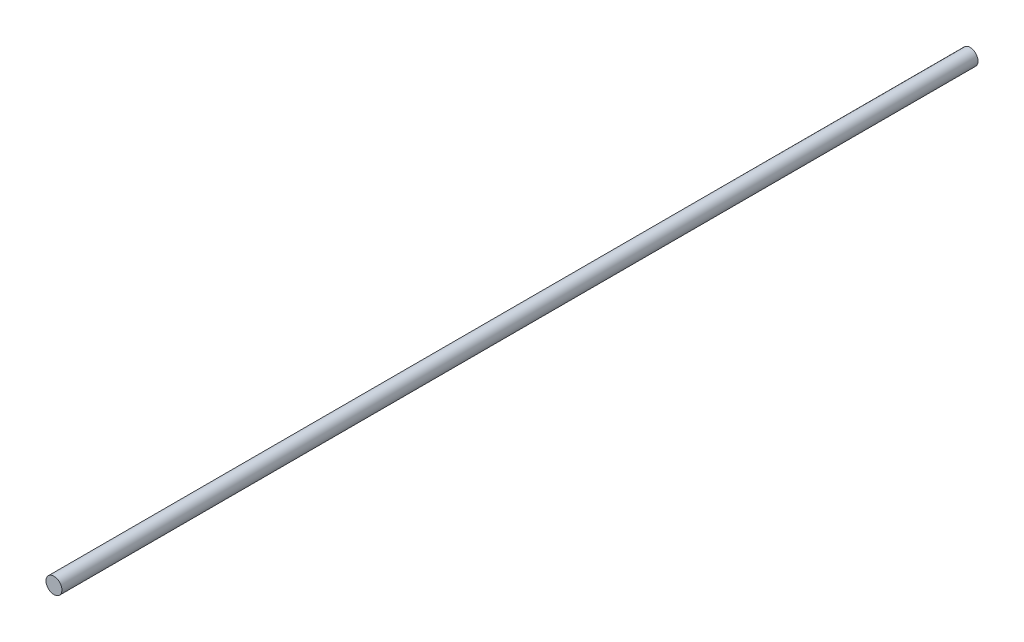
ISO-10303-21;
HEADER;
FILE_DESCRIPTION(('STEP AP214'),'2;1');
FILE_NAME('part.step','',(''),(''),'','','');
FILE_SCHEMA(('AUTOMOTIVE_DESIGN { 1 0 10303 214 1 1 1 1 }'));
ENDSEC;
DATA;
#1=APPLICATION_CONTEXT('core data for automotive mechanical design processes');
#2=APPLICATION_PROTOCOL_DEFINITION('international standard','automotive_design',2000,#1);
#3=PRODUCT_CONTEXT('',#1,'mechanical');
#4=PRODUCT('Part','Part','',(#3));
#5=PRODUCT_RELATED_PRODUCT_CATEGORY('part','',(#4));
#6=PRODUCT_DEFINITION_FORMATION('','',#4);
#7=PRODUCT_DEFINITION_CONTEXT('part definition',#1,'design');
#8=PRODUCT_DEFINITION('design','',#6,#7);
#9=PRODUCT_DEFINITION_SHAPE('','',#8);
#10=(LENGTH_UNIT() NAMED_UNIT(*) SI_UNIT(.MILLI.,.METRE.));
#11=(NAMED_UNIT(*) PLANE_ANGLE_UNIT() SI_UNIT($,.RADIAN.));
#12=(NAMED_UNIT(*) SI_UNIT($,.STERADIAN.) SOLID_ANGLE_UNIT());
#13=UNCERTAINTY_MEASURE_WITH_UNIT(LENGTH_MEASURE(1.E-05),#10,'distance_accuracy_value','');
#14=(GEOMETRIC_REPRESENTATION_CONTEXT(3) GLOBAL_UNCERTAINTY_ASSIGNED_CONTEXT((#13)) GLOBAL_UNIT_ASSIGNED_CONTEXT((#10,
#11,#12)) REPRESENTATION_CONTEXT('',''));
#15=CARTESIAN_POINT('',(0.,0.,0.));
#16=DIRECTION('',(0.,0.,1.));
#17=DIRECTION('',(1.,0.,0.));
#18=AXIS2_PLACEMENT_3D('',#15,#16,#17);
#19=CARTESIAN_POINT('',(0.,0.,460.));
#20=DIRECTION('',(0.,0.,-1.));
#21=DIRECTION('',(-1.,0.,0.));
#22=AXIS2_PLACEMENT_3D('',#19,#20,#21);
#23=CYLINDRICAL_SURFACE('',#22,4.);
#24=CARTESIAN_POINT('',(0.,0.,460.));
#25=DIRECTION('',(0.,0.,1.));
#26=DIRECTION('',(1.,0.,0.));
#27=AXIS2_PLACEMENT_3D('',#24,#25,#26);
#28=CIRCLE('',#27,4.);
#29=CARTESIAN_POINT('',(4.,0.,460.));
#30=VERTEX_POINT('',#29);
#31=EDGE_CURVE('E10',#30,#30,#28,.T.);
#32=ORIENTED_EDGE('',*,*,#31,.F.);
#33=EDGE_LOOP('',(#32));
#34=FACE_BOUND('',#33,.T.);
#35=CARTESIAN_POINT('',(0.,0.,0.));
#36=DIRECTION('',(0.,0.,1.));
#37=DIRECTION('',(1.,0.,0.));
#38=AXIS2_PLACEMENT_3D('',#35,#36,#37);
#39=CIRCLE('',#38,4.);
#40=CARTESIAN_POINT('',(4.,0.,0.));
#41=VERTEX_POINT('',#40);
#42=EDGE_CURVE('E40',#41,#41,#39,.T.);
#43=ORIENTED_EDGE('',*,*,#42,.T.);
#44=EDGE_LOOP('',(#43));
#45=FACE_BOUND('',#44,.T.);
#46=ADVANCED_FACE('F37',(#34,#45),#23,.T.);
#47=CARTESIAN_POINT('',(0.,0.,460.));
#48=DIRECTION('',(0.,0.,1.));
#49=DIRECTION('',(1.,0.,0.));
#50=AXIS2_PLACEMENT_3D('',#47,#48,#49);
#51=PLANE('',#50);
#52=ORIENTED_EDGE('',*,*,#31,.T.);
#53=EDGE_LOOP('',(#52));
#54=FACE_BOUND('',#53,.T.);
#55=ADVANCED_FACE('F54',(#54),#51,.T.);
#56=CARTESIAN_POINT('',(0.,0.,0.));
#57=DIRECTION('',(0.,0.,1.));
#58=DIRECTION('',(1.,0.,0.));
#59=AXIS2_PLACEMENT_3D('',#56,#57,#58);
#60=PLANE('',#59);
#61=ORIENTED_EDGE('',*,*,#42,.F.);
#62=EDGE_LOOP('',(#61));
#63=FACE_BOUND('',#62,.T.);
#64=ADVANCED_FACE('F52',(#63),#60,.F.);
#65=CLOSED_SHELL('',(#46,#55,#64));
#66=MANIFOLD_SOLID_BREP('B2',#65);
#67=ADVANCED_BREP_SHAPE_REPRESENTATION('',(#18,#66),#14);
#68=SHAPE_DEFINITION_REPRESENTATION(#9,#67);
ENDSEC;
END-ISO-10303-21;
